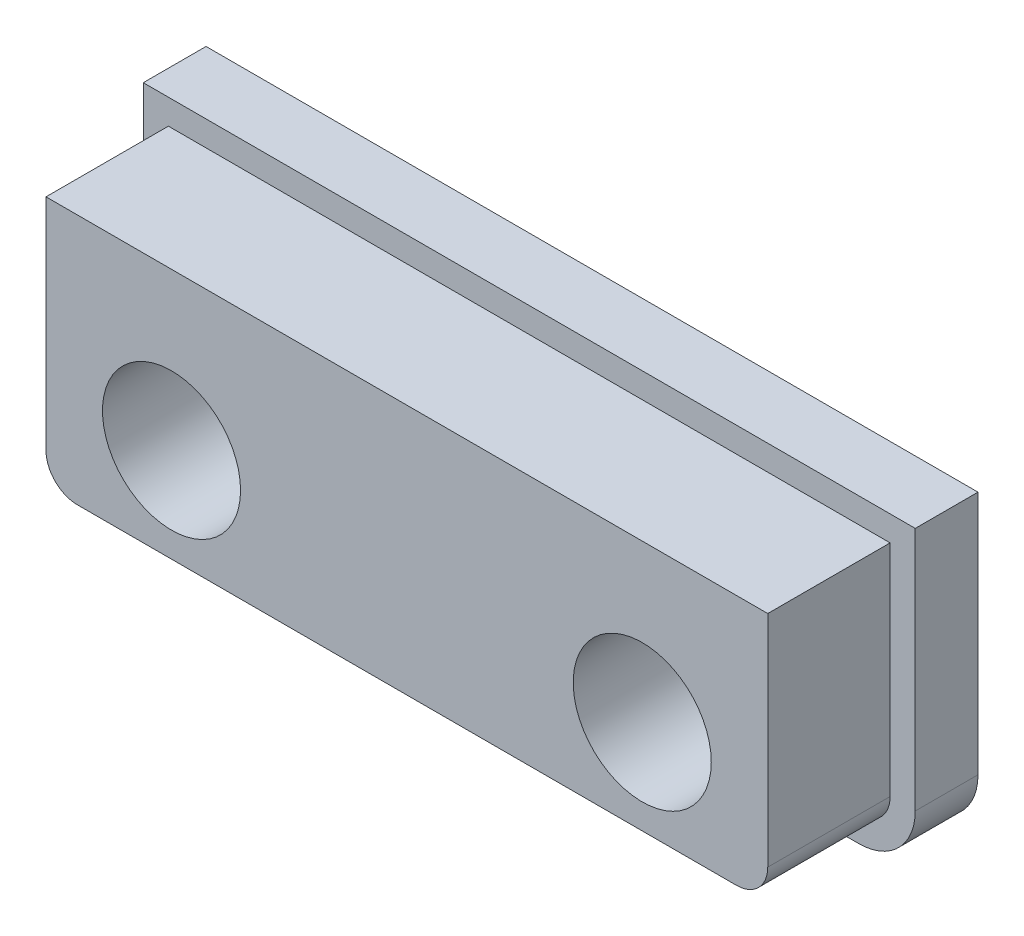
ISO-10303-21;
HEADER;
FILE_DESCRIPTION(('STEP AP214'),'2;1');
FILE_NAME('part.step','',(''),(''),'','','');
FILE_SCHEMA(('AUTOMOTIVE_DESIGN { 1 0 10303 214 1 1 1 1 }'));
ENDSEC;
DATA;
#1=APPLICATION_CONTEXT('core data for automotive mechanical design processes');
#2=APPLICATION_PROTOCOL_DEFINITION('international standard','automotive_design',2000,#1);
#3=PRODUCT_CONTEXT('',#1,'mechanical');
#4=PRODUCT('Part','Part','',(#3));
#5=PRODUCT_RELATED_PRODUCT_CATEGORY('part','',(#4));
#6=PRODUCT_DEFINITION_FORMATION('','',#4);
#7=PRODUCT_DEFINITION_CONTEXT('part definition',#1,'design');
#8=PRODUCT_DEFINITION('design','',#6,#7);
#9=PRODUCT_DEFINITION_SHAPE('','',#8);
#10=(LENGTH_UNIT() NAMED_UNIT(*) SI_UNIT(.MILLI.,.METRE.));
#11=(NAMED_UNIT(*) PLANE_ANGLE_UNIT() SI_UNIT($,.RADIAN.));
#12=(NAMED_UNIT(*) SI_UNIT($,.STERADIAN.) SOLID_ANGLE_UNIT());
#13=UNCERTAINTY_MEASURE_WITH_UNIT(LENGTH_MEASURE(1.E-05),#10,'distance_accuracy_value','');
#14=(GEOMETRIC_REPRESENTATION_CONTEXT(3) GLOBAL_UNCERTAINTY_ASSIGNED_CONTEXT((#13)) GLOBAL_UNIT_ASSIGNED_CONTEXT((#10,
#11,#12)) REPRESENTATION_CONTEXT('',''));
#15=CARTESIAN_POINT('',(0.,0.,0.));
#16=DIRECTION('',(0.,0.,1.));
#17=DIRECTION('',(1.,0.,0.));
#18=AXIS2_PLACEMENT_3D('',#15,#16,#17);
#19=CARTESIAN_POINT('',(1.,1.,3.9));
#20=DIRECTION('',(0.,0.,-1.));
#21=DIRECTION('',(-1.,0.,0.));
#22=AXIS2_PLACEMENT_3D('',#19,#20,#21);
#23=CYLINDRICAL_SURFACE('',#22,1.);
#24=CARTESIAN_POINT('',(1.,1.,0.));
#25=DIRECTION('',(0.,0.,1.));
#26=DIRECTION('',(1.,0.,0.));
#27=AXIS2_PLACEMENT_3D('',#24,#25,#26);
#28=CIRCLE('',#27,1.);
#29=CARTESIAN_POINT('',(1.00000000000001,0.,0.));
#30=VERTEX_POINT('',#29);
#31=CARTESIAN_POINT('',(0.,1.00000000000001,0.));
#32=VERTEX_POINT('',#31);
#33=EDGE_CURVE('E205',#30,#32,#28,.F.);
#34=ORIENTED_EDGE('',*,*,#33,.F.);
#35=DIRECTION('',(0.,0.,-1.));
#36=VECTOR('',#35,1.);
#37=CARTESIAN_POINT('',(1.00000000000001,0.,3.9));
#38=LINE('',#37,#36);
#39=CARTESIAN_POINT('',(1.00000000000001,0.,3.9));
#40=VERTEX_POINT('',#39);
#41=EDGE_CURVE('E11',#40,#30,#38,.T.);
#42=ORIENTED_EDGE('',*,*,#41,.F.);
#43=CARTESIAN_POINT('',(1.,1.,3.9));
#44=DIRECTION('',(0.,0.,1.));
#45=DIRECTION('',(1.,0.,0.));
#46=AXIS2_PLACEMENT_3D('',#43,#44,#45);
#47=CIRCLE('',#46,1.);
#48=CARTESIAN_POINT('',(0.,1.00000000000001,3.9));
#49=VERTEX_POINT('',#48);
#50=EDGE_CURVE('E227',#40,#49,#47,.F.);
#51=ORIENTED_EDGE('',*,*,#50,.T.);
#52=DIRECTION('',(0.,0.,-1.));
#53=VECTOR('',#52,1.);
#54=CARTESIAN_POINT('',(0.,1.00000000000001,3.9));
#55=LINE('',#54,#53);
#56=EDGE_CURVE('E62',#49,#32,#55,.T.);
#57=ORIENTED_EDGE('',*,*,#56,.T.);
#58=EDGE_LOOP('',(#34,#42,#51,#57));
#59=FACE_BOUND('',#58,.T.);
#60=ADVANCED_FACE('F45',(#59),#23,.T.);
#61=CARTESIAN_POINT('',(0.,0.,3.9));
#62=DIRECTION('',(0.,1.,0.));
#63=DIRECTION('',(0.,0.,1.));
#64=AXIS2_PLACEMENT_3D('',#61,#62,#63);
#65=PLANE('',#64);
#66=DIRECTION('',(1.,0.,0.));
#67=VECTOR('',#66,1.);
#68=CARTESIAN_POINT('',(0.,0.,0.));
#69=LINE('',#68,#67);
#70=CARTESIAN_POINT('',(22.,0.,0.));
#71=VERTEX_POINT('',#70);
#72=EDGE_CURVE('E250',#30,#71,#69,.T.);
#73=ORIENTED_EDGE('',*,*,#72,.T.);
#74=DIRECTION('',(0.,0.,-1.));
#75=VECTOR('',#74,1.);
#76=CARTESIAN_POINT('',(22.,0.,3.9));
#77=LINE('',#76,#75);
#78=CARTESIAN_POINT('',(22.,0.,3.9));
#79=VERTEX_POINT('',#78);
#80=EDGE_CURVE('E55',#79,#71,#77,.T.);
#81=ORIENTED_EDGE('',*,*,#80,.F.);
#82=DIRECTION('',(1.,0.,0.));
#83=VECTOR('',#82,1.);
#84=CARTESIAN_POINT('',(0.,0.,3.9));
#85=LINE('',#84,#83);
#86=EDGE_CURVE('E230',#40,#79,#85,.T.);
#87=ORIENTED_EDGE('',*,*,#86,.F.);
#88=ORIENTED_EDGE('',*,*,#41,.T.);
#89=EDGE_LOOP('',(#73,#81,#87,#88));
#90=FACE_BOUND('',#89,.T.);
#91=ADVANCED_FACE('F289',(#90),#65,.F.);
#92=CARTESIAN_POINT('',(22.,1.,3.9));
#93=DIRECTION('',(0.,0.,-1.));
#94=DIRECTION('',(-1.,0.,0.));
#95=AXIS2_PLACEMENT_3D('',#92,#93,#94);
#96=CYLINDRICAL_SURFACE('',#95,1.);
#97=CARTESIAN_POINT('',(22.,1.,0.));
#98=DIRECTION('',(0.,0.,1.));
#99=DIRECTION('',(1.,0.,0.));
#100=AXIS2_PLACEMENT_3D('',#97,#98,#99);
#101=CIRCLE('',#100,1.);
#102=CARTESIAN_POINT('',(23.,1.,0.));
#103=VERTEX_POINT('',#102);
#104=EDGE_CURVE('E254',#71,#103,#101,.T.);
#105=ORIENTED_EDGE('',*,*,#104,.T.);
#106=DIRECTION('',(0.,0.,-1.));
#107=VECTOR('',#106,1.);
#108=CARTESIAN_POINT('',(23.,1.,3.9));
#109=LINE('',#108,#107);
#110=CARTESIAN_POINT('',(23.,1.,3.9));
#111=VERTEX_POINT('',#110);
#112=EDGE_CURVE('E277',#111,#103,#109,.T.);
#113=ORIENTED_EDGE('',*,*,#112,.F.);
#114=CARTESIAN_POINT('',(22.,1.,3.9));
#115=DIRECTION('',(0.,0.,1.));
#116=DIRECTION('',(1.,0.,0.));
#117=AXIS2_PLACEMENT_3D('',#114,#115,#116);
#118=CIRCLE('',#117,1.);
#119=EDGE_CURVE('E234',#79,#111,#118,.T.);
#120=ORIENTED_EDGE('',*,*,#119,.F.);
#121=ORIENTED_EDGE('',*,*,#80,.T.);
#122=EDGE_LOOP('',(#105,#113,#120,#121));
#123=FACE_BOUND('',#122,.T.);
#124=ADVANCED_FACE('F284',(#123),#96,.T.);
#125=CARTESIAN_POINT('',(23.,0.,3.9));
#126=DIRECTION('',(-1.,0.,0.));
#127=DIRECTION('',(0.,0.,1.));
#128=AXIS2_PLACEMENT_3D('',#125,#126,#127);
#129=PLANE('',#128);
#130=DIRECTION('',(0.,1.,0.));
#131=VECTOR('',#130,1.);
#132=CARTESIAN_POINT('',(23.,0.,0.));
#133=LINE('',#132,#131);
#134=CARTESIAN_POINT('',(23.,8.,0.));
#135=VERTEX_POINT('',#134);
#136=EDGE_CURVE('E258',#103,#135,#133,.T.);
#137=ORIENTED_EDGE('',*,*,#136,.T.);
#138=DIRECTION('',(0.,0.,-1.));
#139=VECTOR('',#138,1.);
#140=CARTESIAN_POINT('',(23.,8.,3.9));
#141=LINE('',#140,#139);
#142=CARTESIAN_POINT('',(23.,8.,3.9));
#143=VERTEX_POINT('',#142);
#144=EDGE_CURVE('E273',#143,#135,#141,.T.);
#145=ORIENTED_EDGE('',*,*,#144,.F.);
#146=DIRECTION('',(0.,1.,0.));
#147=VECTOR('',#146,1.);
#148=CARTESIAN_POINT('',(23.,0.,3.9));
#149=LINE('',#148,#147);
#150=EDGE_CURVE('E238',#111,#143,#149,.T.);
#151=ORIENTED_EDGE('',*,*,#150,.F.);
#152=ORIENTED_EDGE('',*,*,#112,.T.);
#153=EDGE_LOOP('',(#137,#145,#151,#152));
#154=FACE_BOUND('',#153,.T.);
#155=ADVANCED_FACE('F297',(#154),#129,.F.);
#156=CARTESIAN_POINT('',(0.,8.,3.9));
#157=DIRECTION('',(0.,1.,0.));
#158=DIRECTION('',(0.,0.,1.));
#159=AXIS2_PLACEMENT_3D('',#156,#157,#158);
#160=PLANE('',#159);
#161=DIRECTION('',(1.,0.,0.));
#162=VECTOR('',#161,1.);
#163=CARTESIAN_POINT('',(0.,8.,0.));
#164=LINE('',#163,#162);
#165=CARTESIAN_POINT('',(0.,8.,0.));
#166=VERTEX_POINT('',#165);
#167=EDGE_CURVE('E262',#166,#135,#164,.T.);
#168=ORIENTED_EDGE('',*,*,#167,.F.);
#169=DIRECTION('',(0.,0.,-1.));
#170=VECTOR('',#169,1.);
#171=CARTESIAN_POINT('',(0.,8.,3.9));
#172=LINE('',#171,#170);
#173=CARTESIAN_POINT('',(0.,8.,3.9));
#174=VERTEX_POINT('',#173);
#175=EDGE_CURVE('E269',#174,#166,#172,.T.);
#176=ORIENTED_EDGE('',*,*,#175,.F.);
#177=DIRECTION('',(1.,0.,0.));
#178=VECTOR('',#177,1.);
#179=CARTESIAN_POINT('',(0.,8.,3.9));
#180=LINE('',#179,#178);
#181=EDGE_CURVE('E241',#174,#143,#180,.T.);
#182=ORIENTED_EDGE('',*,*,#181,.T.);
#183=ORIENTED_EDGE('',*,*,#144,.T.);
#184=EDGE_LOOP('',(#168,#176,#182,#183));
#185=FACE_BOUND('',#184,.T.);
#186=ADVANCED_FACE('F306',(#185),#160,.T.);
#187=CARTESIAN_POINT('',(4.,3.,3.9));
#188=DIRECTION('',(0.,0.,-1.));
#189=DIRECTION('',(-1.,0.,0.));
#190=AXIS2_PLACEMENT_3D('',#187,#188,#189);
#191=CYLINDRICAL_SURFACE('',#190,2.2);
#192=CARTESIAN_POINT('',(4.,3.,3.9));
#193=DIRECTION('',(0.,0.,1.));
#194=DIRECTION('',(1.,0.,0.));
#195=AXIS2_PLACEMENT_3D('',#192,#193,#194);
#196=CIRCLE('',#195,2.2);
#197=CARTESIAN_POINT('',(6.2,3.,3.9));
#198=VERTEX_POINT('',#197);
#199=EDGE_CURVE('E222',#198,#198,#196,.T.);
#200=ORIENTED_EDGE('',*,*,#199,.T.);
#201=EDGE_LOOP('',(#200));
#202=FACE_BOUND('',#201,.T.);
#203=CARTESIAN_POINT('',(4.,3.,-2.));
#204=DIRECTION('',(0.,0.,1.));
#205=DIRECTION('',(1.,0.,0.));
#206=AXIS2_PLACEMENT_3D('',#203,#204,#205);
#207=CIRCLE('',#206,2.2);
#208=CARTESIAN_POINT('',(6.2,3.,-2.));
#209=VERTEX_POINT('',#208);
#210=EDGE_CURVE('E144',#209,#209,#207,.T.);
#211=ORIENTED_EDGE('',*,*,#210,.F.);
#212=EDGE_LOOP('',(#211));
#213=FACE_BOUND('',#212,.T.);
#214=ADVANCED_FACE('F308',(#202,#213),#191,.F.);
#215=CARTESIAN_POINT('',(19.,3.,3.9));
#216=DIRECTION('',(0.,0.,-1.));
#217=DIRECTION('',(-1.,0.,0.));
#218=AXIS2_PLACEMENT_3D('',#215,#216,#217);
#219=CYLINDRICAL_SURFACE('',#218,2.2);
#220=CARTESIAN_POINT('',(19.,3.,3.9));
#221=DIRECTION('',(0.,0.,1.));
#222=DIRECTION('',(1.,0.,0.));
#223=AXIS2_PLACEMENT_3D('',#220,#221,#222);
#224=CIRCLE('',#223,2.2);
#225=CARTESIAN_POINT('',(21.2,3.,3.9));
#226=VERTEX_POINT('',#225);
#227=EDGE_CURVE('E218',#226,#226,#224,.T.);
#228=ORIENTED_EDGE('',*,*,#227,.T.);
#229=EDGE_LOOP('',(#228));
#230=FACE_BOUND('',#229,.T.);
#231=CARTESIAN_POINT('',(19.,3.,-2.));
#232=DIRECTION('',(0.,0.,1.));
#233=DIRECTION('',(1.,0.,0.));
#234=AXIS2_PLACEMENT_3D('',#231,#232,#233);
#235=CIRCLE('',#234,2.2);
#236=CARTESIAN_POINT('',(21.2,3.,-2.));
#237=VERTEX_POINT('',#236);
#238=EDGE_CURVE('E177',#237,#237,#235,.T.);
#239=ORIENTED_EDGE('',*,*,#238,.F.);
#240=EDGE_LOOP('',(#239));
#241=FACE_BOUND('',#240,.T.);
#242=ADVANCED_FACE('F47',(#230,#241),#219,.F.);
#243=CARTESIAN_POINT('',(0.,0.,3.9));
#244=DIRECTION('',(-1.,0.,0.));
#245=DIRECTION('',(0.,0.,1.));
#246=AXIS2_PLACEMENT_3D('',#243,#244,#245);
#247=PLANE('',#246);
#248=DIRECTION('',(0.,1.,0.));
#249=VECTOR('',#248,1.);
#250=CARTESIAN_POINT('',(0.,0.,0.));
#251=LINE('',#250,#249);
#252=EDGE_CURVE('E223',#32,#166,#251,.T.);
#253=ORIENTED_EDGE('',*,*,#252,.F.);
#254=ORIENTED_EDGE('',*,*,#56,.F.);
#255=DIRECTION('',(0.,1.,0.));
#256=VECTOR('',#255,1.);
#257=CARTESIAN_POINT('',(0.,0.,3.9));
#258=LINE('',#257,#256);
#259=EDGE_CURVE('E245',#49,#174,#258,.T.);
#260=ORIENTED_EDGE('',*,*,#259,.T.);
#261=ORIENTED_EDGE('',*,*,#175,.T.);
#262=EDGE_LOOP('',(#253,#254,#260,#261));
#263=FACE_BOUND('',#262,.T.);
#264=ADVANCED_FACE('F304',(#263),#247,.T.);
#265=CARTESIAN_POINT('',(0.,0.,3.9));
#266=DIRECTION('',(0.,0.,1.));
#267=DIRECTION('',(1.,0.,0.));
#268=AXIS2_PLACEMENT_3D('',#265,#266,#267);
#269=PLANE('',#268);
#270=ORIENTED_EDGE('',*,*,#227,.F.);
#271=EDGE_LOOP('',(#270));
#272=FACE_BOUND('',#271,.T.);
#273=ORIENTED_EDGE('',*,*,#199,.F.);
#274=EDGE_LOOP('',(#273));
#275=FACE_BOUND('',#274,.T.);
#276=ORIENTED_EDGE('',*,*,#50,.F.);
#277=ORIENTED_EDGE('',*,*,#86,.T.);
#278=ORIENTED_EDGE('',*,*,#119,.T.);
#279=ORIENTED_EDGE('',*,*,#150,.T.);
#280=ORIENTED_EDGE('',*,*,#181,.F.);
#281=ORIENTED_EDGE('',*,*,#259,.F.);
#282=EDGE_LOOP('',(#276,#277,#278,#279,#280,#281));
#283=FACE_BOUND('',#282,.T.);
#284=ADVANCED_FACE('F301',(#272,#275,#283),#269,.T.);
#285=CARTESIAN_POINT('',(1.,1.,-2.));
#286=DIRECTION('',(0.,0.,1.));
#287=DIRECTION('',(1.,0.,0.));
#288=AXIS2_PLACEMENT_3D('',#285,#286,#287);
#289=CYLINDRICAL_SURFACE('',#288,1.8);
#290=CARTESIAN_POINT('',(1.,1.,0.));
#291=DIRECTION('',(0.,0.,1.));
#292=DIRECTION('',(1.,0.,0.));
#293=AXIS2_PLACEMENT_3D('',#290,#291,#292);
#294=CIRCLE('',#293,1.8);
#295=CARTESIAN_POINT('',(1.00000000000001,-0.8,0.));
#296=VERTEX_POINT('',#295);
#297=CARTESIAN_POINT('',(-0.8,1.00000000000001,0.));
#298=VERTEX_POINT('',#297);
#299=EDGE_CURVE('E184',#296,#298,#294,.F.);
#300=ORIENTED_EDGE('',*,*,#299,.T.);
#301=DIRECTION('',(0.,0.,1.));
#302=VECTOR('',#301,1.);
#303=CARTESIAN_POINT('',(-0.8,1.00000000000001,-2.));
#304=LINE('',#303,#302);
#305=CARTESIAN_POINT('',(-0.8,1.00000000000001,-2.));
#306=VERTEX_POINT('',#305);
#307=EDGE_CURVE('E151',#306,#298,#304,.T.);
#308=ORIENTED_EDGE('',*,*,#307,.F.);
#309=CARTESIAN_POINT('',(1.,1.,-2.));
#310=DIRECTION('',(0.,0.,1.));
#311=DIRECTION('',(1.,0.,0.));
#312=AXIS2_PLACEMENT_3D('',#309,#310,#311);
#313=CIRCLE('',#312,1.8);
#314=CARTESIAN_POINT('',(1.00000000000001,-0.8,-2.));
#315=VERTEX_POINT('',#314);
#316=EDGE_CURVE('E148',#315,#306,#313,.F.);
#317=ORIENTED_EDGE('',*,*,#316,.F.);
#318=DIRECTION('',(0.,0.,1.));
#319=VECTOR('',#318,1.);
#320=CARTESIAN_POINT('',(1.00000000000001,-0.8,-2.));
#321=LINE('',#320,#319);
#322=EDGE_CURVE('E132',#315,#296,#321,.T.);
#323=ORIENTED_EDGE('',*,*,#322,.T.);
#324=EDGE_LOOP('',(#300,#308,#317,#323));
#325=FACE_BOUND('',#324,.T.);
#326=ADVANCED_FACE('F149',(#325),#289,.T.);
#327=CARTESIAN_POINT('',(-0.8,0.,-2.));
#328=DIRECTION('',(1.,0.,0.));
#329=DIRECTION('',(0.,0.,-1.));
#330=AXIS2_PLACEMENT_3D('',#327,#328,#329);
#331=PLANE('',#330);
#332=DIRECTION('',(0.,1.,0.));
#333=VECTOR('',#332,1.);
#334=CARTESIAN_POINT('',(-0.8,0.,0.));
#335=LINE('',#334,#333);
#336=CARTESIAN_POINT('',(-0.8,8.8,0.));
#337=VERTEX_POINT('',#336);
#338=EDGE_CURVE('E154',#298,#337,#335,.T.);
#339=ORIENTED_EDGE('',*,*,#338,.T.);
#340=DIRECTION('',(0.,0.,1.));
#341=VECTOR('',#340,1.);
#342=CARTESIAN_POINT('',(-0.8,8.8,-2.));
#343=LINE('',#342,#341);
#344=CARTESIAN_POINT('',(-0.8,8.8,-2.));
#345=VERTEX_POINT('',#344);
#346=EDGE_CURVE('E206',#345,#337,#343,.T.);
#347=ORIENTED_EDGE('',*,*,#346,.F.);
#348=DIRECTION('',(0.,1.,0.));
#349=VECTOR('',#348,1.);
#350=CARTESIAN_POINT('',(-0.8,0.,-2.));
#351=LINE('',#350,#349);
#352=EDGE_CURVE('E174',#306,#345,#351,.T.);
#353=ORIENTED_EDGE('',*,*,#352,.F.);
#354=ORIENTED_EDGE('',*,*,#307,.T.);
#355=EDGE_LOOP('',(#339,#347,#353,#354));
#356=FACE_BOUND('',#355,.T.);
#357=ADVANCED_FACE('F375',(#356),#331,.F.);
#358=CARTESIAN_POINT('',(0.,8.8,-2.));
#359=DIRECTION('',(0.,-1.,0.));
#360=DIRECTION('',(0.,0.,-1.));
#361=AXIS2_PLACEMENT_3D('',#358,#359,#360);
#362=PLANE('',#361);
#363=DIRECTION('',(1.,0.,0.));
#364=VECTOR('',#363,1.);
#365=CARTESIAN_POINT('',(0.,8.8,0.));
#366=LINE('',#365,#364);
#367=CARTESIAN_POINT('',(23.8,8.8,0.));
#368=VERTEX_POINT('',#367);
#369=EDGE_CURVE('E197',#337,#368,#366,.T.);
#370=ORIENTED_EDGE('',*,*,#369,.T.);
#371=DIRECTION('',(0.,0.,1.));
#372=VECTOR('',#371,1.);
#373=CARTESIAN_POINT('',(23.8,8.8,-2.));
#374=LINE('',#373,#372);
#375=CARTESIAN_POINT('',(23.8,8.8,-2.));
#376=VERTEX_POINT('',#375);
#377=EDGE_CURVE('E210',#376,#368,#374,.T.);
#378=ORIENTED_EDGE('',*,*,#377,.F.);
#379=DIRECTION('',(1.,0.,0.));
#380=VECTOR('',#379,1.);
#381=CARTESIAN_POINT('',(0.,8.8,-2.));
#382=LINE('',#381,#380);
#383=EDGE_CURVE('E171',#345,#376,#382,.T.);
#384=ORIENTED_EDGE('',*,*,#383,.F.);
#385=ORIENTED_EDGE('',*,*,#346,.T.);
#386=EDGE_LOOP('',(#370,#378,#384,#385));
#387=FACE_BOUND('',#386,.T.);
#388=ADVANCED_FACE('F385',(#387),#362,.F.);
#389=CARTESIAN_POINT('',(23.8,0.,-2.));
#390=DIRECTION('',(1.,0.,0.));
#391=DIRECTION('',(0.,0.,-1.));
#392=AXIS2_PLACEMENT_3D('',#389,#390,#391);
#393=PLANE('',#392);
#394=DIRECTION('',(0.,1.,0.));
#395=VECTOR('',#394,1.);
#396=CARTESIAN_POINT('',(23.8,0.,0.));
#397=LINE('',#396,#395);
#398=CARTESIAN_POINT('',(23.8,1.,0.));
#399=VERTEX_POINT('',#398);
#400=EDGE_CURVE('E193',#399,#368,#397,.T.);
#401=ORIENTED_EDGE('',*,*,#400,.F.);
#402=DIRECTION('',(0.,0.,1.));
#403=VECTOR('',#402,1.);
#404=CARTESIAN_POINT('',(23.8,1.,-2.));
#405=LINE('',#404,#403);
#406=CARTESIAN_POINT('',(23.8,1.,-2.));
#407=VERTEX_POINT('',#406);
#408=EDGE_CURVE('E213',#407,#399,#405,.T.);
#409=ORIENTED_EDGE('',*,*,#408,.F.);
#410=DIRECTION('',(0.,1.,0.));
#411=VECTOR('',#410,1.);
#412=CARTESIAN_POINT('',(23.8,0.,-2.));
#413=LINE('',#412,#411);
#414=EDGE_CURVE('E165',#407,#376,#413,.T.);
#415=ORIENTED_EDGE('',*,*,#414,.T.);
#416=ORIENTED_EDGE('',*,*,#377,.T.);
#417=EDGE_LOOP('',(#401,#409,#415,#416));
#418=FACE_BOUND('',#417,.T.);
#419=ADVANCED_FACE('F396',(#418),#393,.T.);
#420=CARTESIAN_POINT('',(22.,1.,-2.));
#421=DIRECTION('',(0.,0.,1.));
#422=DIRECTION('',(1.,0.,0.));
#423=AXIS2_PLACEMENT_3D('',#420,#421,#422);
#424=CYLINDRICAL_SURFACE('',#423,1.8);
#425=CARTESIAN_POINT('',(22.,1.,0.));
#426=DIRECTION('',(0.,0.,1.));
#427=DIRECTION('',(1.,0.,0.));
#428=AXIS2_PLACEMENT_3D('',#425,#426,#427);
#429=CIRCLE('',#428,1.8);
#430=CARTESIAN_POINT('',(22.,-0.8,0.));
#431=VERTEX_POINT('',#430);
#432=EDGE_CURVE('E189',#431,#399,#429,.T.);
#433=ORIENTED_EDGE('',*,*,#432,.F.);
#434=DIRECTION('',(0.,0.,1.));
#435=VECTOR('',#434,1.);
#436=CARTESIAN_POINT('',(22.,-0.8,-2.));
#437=LINE('',#436,#435);
#438=CARTESIAN_POINT('',(22.,-0.8,-2.));
#439=VERTEX_POINT('',#438);
#440=EDGE_CURVE('E143',#439,#431,#437,.T.);
#441=ORIENTED_EDGE('',*,*,#440,.F.);
#442=CARTESIAN_POINT('',(22.,1.,-2.));
#443=DIRECTION('',(0.,0.,1.));
#444=DIRECTION('',(1.,0.,0.));
#445=AXIS2_PLACEMENT_3D('',#442,#443,#444);
#446=CIRCLE('',#445,1.8);
#447=EDGE_CURVE('E161',#439,#407,#446,.T.);
#448=ORIENTED_EDGE('',*,*,#447,.T.);
#449=ORIENTED_EDGE('',*,*,#408,.T.);
#450=EDGE_LOOP('',(#433,#441,#448,#449));
#451=FACE_BOUND('',#450,.T.);
#452=ADVANCED_FACE('F407',(#451),#424,.T.);
#453=CARTESIAN_POINT('',(0.,-0.8,-2.));
#454=DIRECTION('',(0.,-1.,0.));
#455=DIRECTION('',(1.,0.,0.));
#456=AXIS2_PLACEMENT_3D('',#453,#454,#455);
#457=PLANE('',#456);
#458=DIRECTION('',(1.,0.,0.));
#459=VECTOR('',#458,1.);
#460=CARTESIAN_POINT('',(0.,-0.8,0.));
#461=LINE('',#460,#459);
#462=EDGE_CURVE('E138',#296,#431,#461,.T.);
#463=ORIENTED_EDGE('',*,*,#462,.F.);
#464=ORIENTED_EDGE('',*,*,#322,.F.);
#465=DIRECTION('',(1.,0.,0.));
#466=VECTOR('',#465,1.);
#467=CARTESIAN_POINT('',(0.,-0.8,-2.));
#468=LINE('',#467,#466);
#469=EDGE_CURVE('E136',#315,#439,#468,.T.);
#470=ORIENTED_EDGE('',*,*,#469,.T.);
#471=ORIENTED_EDGE('',*,*,#440,.T.);
#472=EDGE_LOOP('',(#463,#464,#470,#471));
#473=FACE_BOUND('',#472,.T.);
#474=ADVANCED_FACE('F134',(#473),#457,.T.);
#475=CARTESIAN_POINT('',(0.,0.,-2.));
#476=DIRECTION('',(0.,0.,1.));
#477=DIRECTION('',(1.,0.,0.));
#478=AXIS2_PLACEMENT_3D('',#475,#476,#477);
#479=PLANE('',#478);
#480=ORIENTED_EDGE('',*,*,#316,.T.);
#481=ORIENTED_EDGE('',*,*,#352,.T.);
#482=ORIENTED_EDGE('',*,*,#383,.T.);
#483=ORIENTED_EDGE('',*,*,#414,.F.);
#484=ORIENTED_EDGE('',*,*,#447,.F.);
#485=ORIENTED_EDGE('',*,*,#469,.F.);
#486=EDGE_LOOP('',(#480,#481,#482,#483,#484,#485));
#487=FACE_BOUND('',#486,.T.);
#488=ORIENTED_EDGE('',*,*,#238,.T.);
#489=EDGE_LOOP('',(#488));
#490=FACE_BOUND('',#489,.T.);
#491=ORIENTED_EDGE('',*,*,#210,.T.);
#492=EDGE_LOOP('',(#491));
#493=FACE_BOUND('',#492,.T.);
#494=ADVANCED_FACE('F157',(#487,#490,#493),#479,.F.);
#495=CARTESIAN_POINT('',(0.,0.,0.));
#496=DIRECTION('',(0.,0.,1.));
#497=DIRECTION('',(1.,0.,0.));
#498=AXIS2_PLACEMENT_3D('',#495,#496,#497);
#499=PLANE('',#498);
#500=ORIENTED_EDGE('',*,*,#72,.F.);
#501=ORIENTED_EDGE('',*,*,#33,.T.);
#502=ORIENTED_EDGE('',*,*,#252,.T.);
#503=ORIENTED_EDGE('',*,*,#167,.T.);
#504=ORIENTED_EDGE('',*,*,#136,.F.);
#505=ORIENTED_EDGE('',*,*,#104,.F.);
#506=EDGE_LOOP('',(#500,#501,#502,#503,#504,#505));
#507=FACE_BOUND('',#506,.T.);
#508=ORIENTED_EDGE('',*,*,#299,.F.);
#509=ORIENTED_EDGE('',*,*,#462,.T.);
#510=ORIENTED_EDGE('',*,*,#432,.T.);
#511=ORIENTED_EDGE('',*,*,#400,.T.);
#512=ORIENTED_EDGE('',*,*,#369,.F.);
#513=ORIENTED_EDGE('',*,*,#338,.F.);
#514=EDGE_LOOP('',(#508,#509,#510,#511,#512,#513));
#515=FACE_BOUND('',#514,.T.);
#516=ADVANCED_FACE('F292',(#507,#515),#499,.T.);
#517=CLOSED_SHELL('',(#60,#91,#124,#155,#186,#214,#242,#264,#284,#326,#357,#388,#419,#452,#474,
#494,#516));
#518=MANIFOLD_SOLID_BREP('B2',#517);
#519=ADVANCED_BREP_SHAPE_REPRESENTATION('',(#18,#518),#14);
#520=SHAPE_DEFINITION_REPRESENTATION(#9,#519);
ENDSEC;
END-ISO-10303-21;
